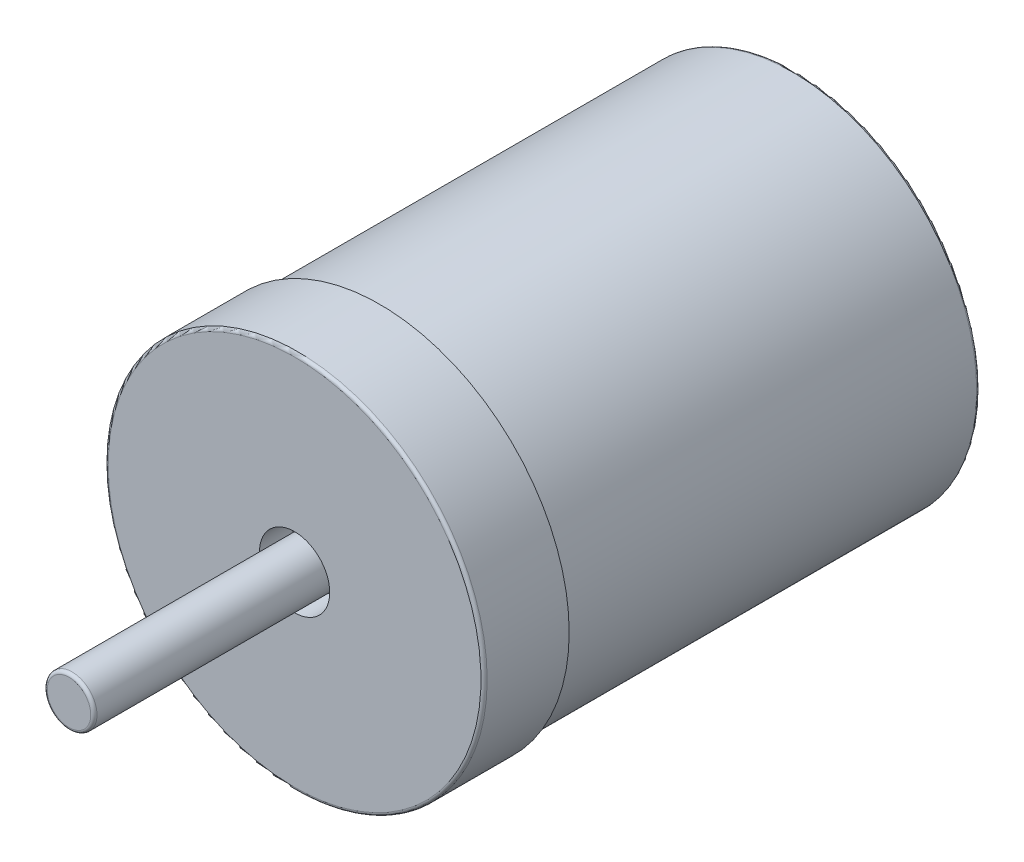
ISO-10303-21;
HEADER;
FILE_DESCRIPTION(('STEP AP214'),'2;1');
FILE_NAME('part.step','',(''),(''),'','','');
FILE_SCHEMA(('AUTOMOTIVE_DESIGN { 1 0 10303 214 1 1 1 1 }'));
ENDSEC;
DATA;
#1=APPLICATION_CONTEXT('core data for automotive mechanical design processes');
#2=APPLICATION_PROTOCOL_DEFINITION('international standard','automotive_design',2000,#1);
#3=PRODUCT_CONTEXT('',#1,'mechanical');
#4=PRODUCT('Part','Part','',(#3));
#5=PRODUCT_RELATED_PRODUCT_CATEGORY('part','',(#4));
#6=PRODUCT_DEFINITION_FORMATION('','',#4);
#7=PRODUCT_DEFINITION_CONTEXT('part definition',#1,'design');
#8=PRODUCT_DEFINITION('design','',#6,#7);
#9=PRODUCT_DEFINITION_SHAPE('','',#8);
#10=(LENGTH_UNIT() NAMED_UNIT(*) SI_UNIT(.MILLI.,.METRE.));
#11=(NAMED_UNIT(*) PLANE_ANGLE_UNIT() SI_UNIT($,.RADIAN.));
#12=(NAMED_UNIT(*) SI_UNIT($,.STERADIAN.) SOLID_ANGLE_UNIT());
#13=UNCERTAINTY_MEASURE_WITH_UNIT(LENGTH_MEASURE(1.E-05),#10,'distance_accuracy_value','');
#14=(GEOMETRIC_REPRESENTATION_CONTEXT(3) GLOBAL_UNCERTAINTY_ASSIGNED_CONTEXT((#13)) GLOBAL_UNIT_ASSIGNED_CONTEXT((#10,
#11,#12)) REPRESENTATION_CONTEXT('',''));
#15=CARTESIAN_POINT('',(0.,0.,0.));
#16=DIRECTION('',(0.,0.,1.));
#17=DIRECTION('',(1.,0.,0.));
#18=AXIS2_PLACEMENT_3D('',#15,#16,#17);
#19=CARTESIAN_POINT('',(0.,5.65290066844561,0.));
#20=DIRECTION('',(0.,0.,-1.));
#21=DIRECTION('',(-1.,0.,0.));
#22=AXIS2_PLACEMENT_3D('',#19,#20,#21);
#23=PLANE('',#22);
#24=CARTESIAN_POINT('',(0.,0.,0.));
#25=DIRECTION('',(0.,0.,-1.));
#26=DIRECTION('',(-1.,0.,0.));
#27=AXIS2_PLACEMENT_3D('',#24,#25,#26);
#28=CIRCLE('',#27,30.);
#29=CARTESIAN_POINT('',(-30.,0.,0.));
#30=VERTEX_POINT('',#29);
#31=EDGE_CURVE('E56',#30,#30,#28,.F.);
#32=ORIENTED_EDGE('',*,*,#31,.T.);
#33=EDGE_LOOP('',(#32));
#34=FACE_BOUND('',#33,.T.);
#35=CARTESIAN_POINT('',(0.,0.,0.));
#36=DIRECTION('',(0.,0.,1.));
#37=DIRECTION('',(1.,0.,0.));
#38=AXIS2_PLACEMENT_3D('',#35,#36,#37);
#39=CIRCLE('',#38,5.65290066844561);
#40=CARTESIAN_POINT('',(5.65290066844561,0.,0.));
#41=VERTEX_POINT('',#40);
#42=EDGE_CURVE('E86',#41,#41,#39,.T.);
#43=ORIENTED_EDGE('',*,*,#42,.F.);
#44=EDGE_LOOP('',(#43));
#45=FACE_BOUND('',#44,.T.);
#46=ADVANCED_FACE('F33',(#34,#45),#23,.F.);
#47=CARTESIAN_POINT('',(0.,0.,36.3085957209374));
#48=DIRECTION('',(0.,0.,1.));
#49=DIRECTION('',(1.,0.,0.));
#50=AXIS2_PLACEMENT_3D('',#47,#48,#49);
#51=CYLINDRICAL_SURFACE('',#50,30.5);
#52=CARTESIAN_POINT('',(0.,0.,-0.5));
#53=DIRECTION('',(0.,0.,-1.));
#54=DIRECTION('',(-1.,0.,0.));
#55=AXIS2_PLACEMENT_3D('',#52,#53,#54);
#56=CIRCLE('',#55,30.5);
#57=CARTESIAN_POINT('',(-30.5,0.,-0.5));
#58=VERTEX_POINT('',#57);
#59=EDGE_CURVE('E53',#58,#58,#56,.T.);
#60=ORIENTED_EDGE('',*,*,#59,.T.);
#61=EDGE_LOOP('',(#60));
#62=FACE_BOUND('',#61,.T.);
#63=CARTESIAN_POINT('',(0.,0.,-13.7));
#64=DIRECTION('',(0.,0.,1.));
#65=DIRECTION('',(1.,0.,0.));
#66=AXIS2_PLACEMENT_3D('',#63,#64,#65);
#67=CIRCLE('',#66,30.5);
#68=CARTESIAN_POINT('',(30.5,0.,-13.7));
#69=VERTEX_POINT('',#68);
#70=EDGE_CURVE('E65',#69,#69,#67,.T.);
#71=ORIENTED_EDGE('',*,*,#70,.T.);
#72=EDGE_LOOP('',(#71));
#73=FACE_BOUND('',#72,.T.);
#74=ADVANCED_FACE('F93',(#62,#73),#51,.T.);
#75=CARTESIAN_POINT('',(0.,30.5,-13.7));
#76=DIRECTION('',(0.,0.,1.));
#77=DIRECTION('',(1.,0.,0.));
#78=AXIS2_PLACEMENT_3D('',#75,#76,#77);
#79=PLANE('',#78);
#80=ORIENTED_EDGE('',*,*,#70,.F.);
#81=EDGE_LOOP('',(#80));
#82=FACE_BOUND('',#81,.T.);
#83=CARTESIAN_POINT('',(0.,0.,-13.7));
#84=DIRECTION('',(0.,0.,1.));
#85=DIRECTION('',(1.,0.,0.));
#86=AXIS2_PLACEMENT_3D('',#83,#84,#85);
#87=CIRCLE('',#86,29.5974840893646);
#88=CARTESIAN_POINT('',(29.5974840893646,0.,-13.7));
#89=VERTEX_POINT('',#88);
#90=EDGE_CURVE('E68',#89,#89,#87,.T.);
#91=ORIENTED_EDGE('',*,*,#90,.T.);
#92=EDGE_LOOP('',(#91));
#93=FACE_BOUND('',#92,.T.);
#94=ADVANCED_FACE('F99',(#82,#93),#79,.F.);
#95=CARTESIAN_POINT('',(0.,0.,36.3085957209374));
#96=DIRECTION('',(0.,0.,1.));
#97=DIRECTION('',(1.,0.,0.));
#98=AXIS2_PLACEMENT_3D('',#95,#96,#97);
#99=CYLINDRICAL_SURFACE('',#98,29.5974840893646);
#100=CARTESIAN_POINT('',(0.,0.,-80.2));
#101=DIRECTION('',(0.,0.,1.));
#102=DIRECTION('',(1.,0.,0.));
#103=AXIS2_PLACEMENT_3D('',#100,#101,#102);
#104=CIRCLE('',#103,29.5974840893646);
#105=CARTESIAN_POINT('',(29.5974840893646,0.,-80.2));
#106=VERTEX_POINT('',#105);
#107=EDGE_CURVE('E62',#106,#106,#104,.T.);
#108=ORIENTED_EDGE('',*,*,#107,.T.);
#109=EDGE_LOOP('',(#108));
#110=FACE_BOUND('',#109,.T.);
#111=ORIENTED_EDGE('',*,*,#90,.F.);
#112=EDGE_LOOP('',(#111));
#113=FACE_BOUND('',#112,.T.);
#114=ADVANCED_FACE('F145',(#110,#113),#99,.T.);
#115=CARTESIAN_POINT('',(0.,11.5851616014873,-80.7));
#116=DIRECTION('',(0.,0.,1.));
#117=DIRECTION('',(1.,0.,0.));
#118=AXIS2_PLACEMENT_3D('',#115,#116,#117);
#119=PLANE('',#118);
#120=CARTESIAN_POINT('',(0.,0.,-80.7));
#121=DIRECTION('',(0.,0.,1.));
#122=DIRECTION('',(1.,0.,0.));
#123=AXIS2_PLACEMENT_3D('',#120,#121,#122);
#124=CIRCLE('',#123,29.0974840893646);
#125=CARTESIAN_POINT('',(29.0974840893646,0.,-80.7));
#126=VERTEX_POINT('',#125);
#127=EDGE_CURVE('E59',#126,#126,#124,.F.);
#128=ORIENTED_EDGE('',*,*,#127,.T.);
#129=EDGE_LOOP('',(#128));
#130=FACE_BOUND('',#129,.T.);
#131=CARTESIAN_POINT('',(0.,0.,-80.7));
#132=DIRECTION('',(0.,0.,1.));
#133=DIRECTION('',(1.,0.,0.));
#134=AXIS2_PLACEMENT_3D('',#131,#132,#133);
#135=CIRCLE('',#134,11.5851616014873);
#136=CARTESIAN_POINT('',(11.5851616014873,0.,-80.7));
#137=VERTEX_POINT('',#136);
#138=EDGE_CURVE('E71',#137,#137,#135,.T.);
#139=ORIENTED_EDGE('',*,*,#138,.T.);
#140=EDGE_LOOP('',(#139));
#141=FACE_BOUND('',#140,.T.);
#142=ADVANCED_FACE('F137',(#130,#141),#119,.F.);
#143=CARTESIAN_POINT('',(0.,0.,36.3085957209374));
#144=DIRECTION('',(0.,0.,1.));
#145=DIRECTION('',(1.,0.,0.));
#146=AXIS2_PLACEMENT_3D('',#143,#144,#145);
#147=CYLINDRICAL_SURFACE('',#146,11.5851616014873);
#148=ORIENTED_EDGE('',*,*,#138,.F.);
#149=EDGE_LOOP('',(#148));
#150=FACE_BOUND('',#149,.T.);
#151=CARTESIAN_POINT('',(0.,0.,-88.1644970180692));
#152=DIRECTION('',(0.,0.,1.));
#153=DIRECTION('',(1.,0.,0.));
#154=AXIS2_PLACEMENT_3D('',#151,#152,#153);
#155=CIRCLE('',#154,11.5851616014873);
#156=CARTESIAN_POINT('',(11.5851616014873,0.,-88.1644970180692));
#157=VERTEX_POINT('',#156);
#158=EDGE_CURVE('E74',#157,#157,#155,.T.);
#159=ORIENTED_EDGE('',*,*,#158,.T.);
#160=EDGE_LOOP('',(#159));
#161=FACE_BOUND('',#160,.T.);
#162=ADVANCED_FACE('F131',(#150,#161),#147,.T.);
#163=CARTESIAN_POINT('',(0.,4.,-88.1644970180692));
#164=DIRECTION('',(0.,0.,1.));
#165=DIRECTION('',(1.,0.,0.));
#166=AXIS2_PLACEMENT_3D('',#163,#164,#165);
#167=PLANE('',#166);
#168=ORIENTED_EDGE('',*,*,#158,.F.);
#169=EDGE_LOOP('',(#168));
#170=FACE_BOUND('',#169,.T.);
#171=CARTESIAN_POINT('',(0.,0.,-88.1644970180692));
#172=DIRECTION('',(0.,0.,1.));
#173=DIRECTION('',(1.,0.,0.));
#174=AXIS2_PLACEMENT_3D('',#171,#172,#173);
#175=CIRCLE('',#174,4.);
#176=CARTESIAN_POINT('',(4.,0.,-88.1644970180692));
#177=VERTEX_POINT('',#176);
#178=EDGE_CURVE('E77',#177,#177,#175,.T.);
#179=ORIENTED_EDGE('',*,*,#178,.T.);
#180=EDGE_LOOP('',(#179));
#181=FACE_BOUND('',#180,.T.);
#182=ADVANCED_FACE('F126',(#170,#181),#167,.F.);
#183=CARTESIAN_POINT('',(0.,0.,36.3085957209374));
#184=DIRECTION('',(0.,0.,1.));
#185=DIRECTION('',(1.,0.,0.));
#186=AXIS2_PLACEMENT_3D('',#183,#184,#185);
#187=CYLINDRICAL_SURFACE('',#186,4.);
#188=CARTESIAN_POINT('',(0.,0.,-89.8914042790626));
#189=DIRECTION('',(0.,0.,1.));
#190=DIRECTION('',(1.,0.,0.));
#191=AXIS2_PLACEMENT_3D('',#188,#189,#190);
#192=CIRCLE('',#191,4.);
#193=CARTESIAN_POINT('',(4.,0.,-89.8914042790626));
#194=VERTEX_POINT('',#193);
#195=EDGE_CURVE('E48',#194,#194,#192,.T.);
#196=ORIENTED_EDGE('',*,*,#195,.T.);
#197=EDGE_LOOP('',(#196));
#198=FACE_BOUND('',#197,.T.);
#199=ORIENTED_EDGE('',*,*,#178,.F.);
#200=EDGE_LOOP('',(#199));
#201=FACE_BOUND('',#200,.T.);
#202=ADVANCED_FACE('F122',(#198,#201),#187,.T.);
#203=CARTESIAN_POINT('',(0.,0.,-90.3914042790626));
#204=DIRECTION('',(0.,0.,1.));
#205=DIRECTION('',(1.,0.,0.));
#206=AXIS2_PLACEMENT_3D('',#203,#204,#205);
#207=PLANE('',#206);
#208=CARTESIAN_POINT('',(0.,0.,-90.3914042790626));
#209=DIRECTION('',(0.,0.,1.));
#210=DIRECTION('',(1.,0.,0.));
#211=AXIS2_PLACEMENT_3D('',#208,#209,#210);
#212=CIRCLE('',#211,3.5);
#213=CARTESIAN_POINT('',(3.5,0.,-90.3914042790626));
#214=VERTEX_POINT('',#213);
#215=EDGE_CURVE('E44',#214,#214,#212,.F.);
#216=ORIENTED_EDGE('',*,*,#215,.T.);
#217=EDGE_LOOP('',(#216));
#218=FACE_BOUND('',#217,.T.);
#219=ADVANCED_FACE('F125',(#218),#207,.F.);
#220=CARTESIAN_POINT('',(0.,0.,36.3085957209374));
#221=DIRECTION('',(0.,0.,-1.));
#222=DIRECTION('',(-1.,0.,0.));
#223=AXIS2_PLACEMENT_3D('',#220,#221,#222);
#224=PLANE('',#223);
#225=CARTESIAN_POINT('',(0.,0.,36.3085957209374));
#226=DIRECTION('',(0.,0.,-1.));
#227=DIRECTION('',(-1.,0.,0.));
#228=AXIS2_PLACEMENT_3D('',#225,#226,#227);
#229=CIRCLE('',#228,3.5);
#230=CARTESIAN_POINT('',(-3.5,0.,36.3085957209374));
#231=VERTEX_POINT('',#230);
#232=EDGE_CURVE('E40',#231,#231,#229,.F.);
#233=ORIENTED_EDGE('',*,*,#232,.T.);
#234=EDGE_LOOP('',(#233));
#235=FACE_BOUND('',#234,.T.);
#236=ADVANCED_FACE('F246',(#235),#224,.F.);
#237=CARTESIAN_POINT('',(0.,0.,36.3085957209374));
#238=DIRECTION('',(0.,0.,1.));
#239=DIRECTION('',(1.,0.,0.));
#240=AXIS2_PLACEMENT_3D('',#237,#238,#239);
#241=CYLINDRICAL_SURFACE('',#240,4.);
#242=CARTESIAN_POINT('',(0.,0.,35.8085957209374));
#243=DIRECTION('',(0.,0.,-1.));
#244=DIRECTION('',(-1.,0.,0.));
#245=AXIS2_PLACEMENT_3D('',#242,#243,#244);
#246=CIRCLE('',#245,4.);
#247=CARTESIAN_POINT('',(-4.,0.,35.8085957209374));
#248=VERTEX_POINT('',#247);
#249=EDGE_CURVE('E10',#248,#248,#246,.T.);
#250=ORIENTED_EDGE('',*,*,#249,.T.);
#251=EDGE_LOOP('',(#250));
#252=FACE_BOUND('',#251,.T.);
#253=CARTESIAN_POINT('',(0.,0.,-5.41382479686321));
#254=DIRECTION('',(0.,0.,1.));
#255=DIRECTION('',(1.,0.,0.));
#256=AXIS2_PLACEMENT_3D('',#253,#254,#255);
#257=CIRCLE('',#256,4.);
#258=CARTESIAN_POINT('',(4.,0.,-5.41382479686321));
#259=VERTEX_POINT('',#258);
#260=EDGE_CURVE('E80',#259,#259,#257,.T.);
#261=ORIENTED_EDGE('',*,*,#260,.T.);
#262=EDGE_LOOP('',(#261));
#263=FACE_BOUND('',#262,.T.);
#264=ADVANCED_FACE('F189',(#252,#263),#241,.T.);
#265=CARTESIAN_POINT('',(0.,4.,-5.41382479686321));
#266=DIRECTION('',(0.,0.,-1.));
#267=DIRECTION('',(-1.,0.,0.));
#268=AXIS2_PLACEMENT_3D('',#265,#266,#267);
#269=PLANE('',#268);
#270=ORIENTED_EDGE('',*,*,#260,.F.);
#271=EDGE_LOOP('',(#270));
#272=FACE_BOUND('',#271,.T.);
#273=CARTESIAN_POINT('',(0.,0.,-5.41382479686321));
#274=DIRECTION('',(0.,0.,1.));
#275=DIRECTION('',(1.,0.,0.));
#276=AXIS2_PLACEMENT_3D('',#273,#274,#275);
#277=CIRCLE('',#276,5.65290066844561);
#278=CARTESIAN_POINT('',(5.65290066844561,0.,-5.41382479686321));
#279=VERTEX_POINT('',#278);
#280=EDGE_CURVE('E83',#279,#279,#277,.T.);
#281=ORIENTED_EDGE('',*,*,#280,.T.);
#282=EDGE_LOOP('',(#281));
#283=FACE_BOUND('',#282,.T.);
#284=ADVANCED_FACE('F184',(#272,#283),#269,.F.);
#285=CARTESIAN_POINT('',(0.,0.,36.3085957209374));
#286=DIRECTION('',(0.,0.,1.));
#287=DIRECTION('',(1.,0.,0.));
#288=AXIS2_PLACEMENT_3D('',#285,#286,#287);
#289=CYLINDRICAL_SURFACE('',#288,5.65290066844561);
#290=ORIENTED_EDGE('',*,*,#280,.F.);
#291=EDGE_LOOP('',(#290));
#292=FACE_BOUND('',#291,.T.);
#293=ORIENTED_EDGE('',*,*,#42,.T.);
#294=EDGE_LOOP('',(#293));
#295=FACE_BOUND('',#294,.T.);
#296=ADVANCED_FACE('F90',(#292,#295),#289,.F.);
#297=CARTESIAN_POINT('',(0.,0.,-80.2));
#298=DIRECTION('',(0.,0.,1.));
#299=DIRECTION('',(1.,0.,0.));
#300=AXIS2_PLACEMENT_3D('',#297,#298,#299);
#301=TOROIDAL_SURFACE('',#300,29.0974840893646,0.5);
#302=ORIENTED_EDGE('',*,*,#127,.F.);
#303=EDGE_LOOP('',(#302));
#304=FACE_BOUND('',#303,.T.);
#305=ORIENTED_EDGE('',*,*,#107,.F.);
#306=EDGE_LOOP('',(#305));
#307=FACE_BOUND('',#306,.T.);
#308=ADVANCED_FACE('F104',(#304,#307),#301,.T.);
#309=CARTESIAN_POINT('',(0.,0.,-0.5));
#310=DIRECTION('',(0.,0.,-1.));
#311=DIRECTION('',(-1.,0.,0.));
#312=AXIS2_PLACEMENT_3D('',#309,#310,#311);
#313=TOROIDAL_SURFACE('',#312,30.,0.5);
#314=ORIENTED_EDGE('',*,*,#59,.F.);
#315=EDGE_LOOP('',(#314));
#316=FACE_BOUND('',#315,.T.);
#317=ORIENTED_EDGE('',*,*,#31,.F.);
#318=EDGE_LOOP('',(#317));
#319=FACE_BOUND('',#318,.T.);
#320=ADVANCED_FACE('F107',(#316,#319),#313,.T.);
#321=CARTESIAN_POINT('',(0.,0.,-89.8914042790626));
#322=DIRECTION('',(0.,0.,1.));
#323=DIRECTION('',(1.,0.,0.));
#324=AXIS2_PLACEMENT_3D('',#321,#322,#323);
#325=TOROIDAL_SURFACE('',#324,3.5,0.5);
#326=ORIENTED_EDGE('',*,*,#215,.F.);
#327=EDGE_LOOP('',(#326));
#328=FACE_BOUND('',#327,.T.);
#329=ORIENTED_EDGE('',*,*,#195,.F.);
#330=EDGE_LOOP('',(#329));
#331=FACE_BOUND('',#330,.T.);
#332=ADVANCED_FACE('F110',(#328,#331),#325,.T.);
#333=CARTESIAN_POINT('',(0.,0.,35.8085957209374));
#334=DIRECTION('',(0.,0.,-1.));
#335=DIRECTION('',(-1.,0.,0.));
#336=AXIS2_PLACEMENT_3D('',#333,#334,#335);
#337=TOROIDAL_SURFACE('',#336,3.5,0.5);
#338=ORIENTED_EDGE('',*,*,#249,.F.);
#339=EDGE_LOOP('',(#338));
#340=FACE_BOUND('',#339,.T.);
#341=ORIENTED_EDGE('',*,*,#232,.F.);
#342=EDGE_LOOP('',(#341));
#343=FACE_BOUND('',#342,.T.);
#344=ADVANCED_FACE('F35',(#340,#343),#337,.T.);
#345=CLOSED_SHELL('',(#46,#74,#94,#114,#142,#162,#182,#202,#219,#236,#264,#284,#296,#308,#320,
#332,#344));
#346=MANIFOLD_SOLID_BREP('B2',#345);
#347=ADVANCED_BREP_SHAPE_REPRESENTATION('',(#18,#346),#14);
#348=SHAPE_DEFINITION_REPRESENTATION(#9,#347);
ENDSEC;
END-ISO-10303-21;
